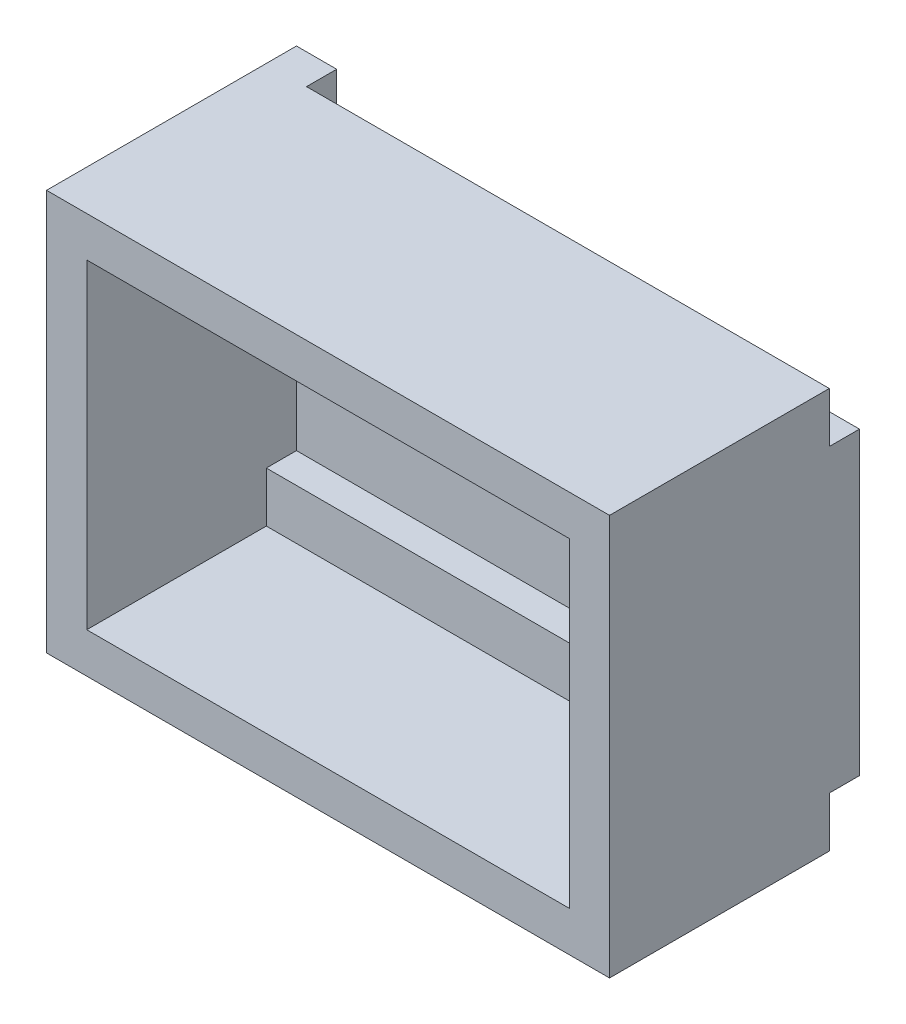
ISO-10303-21;
HEADER;
FILE_DESCRIPTION(('STEP AP214'),'2;1');
FILE_NAME('part.step','',(''),(''),'','','');
FILE_SCHEMA(('AUTOMOTIVE_DESIGN { 1 0 10303 214 1 1 1 1 }'));
ENDSEC;
DATA;
#1=APPLICATION_CONTEXT('core data for automotive mechanical design processes');
#2=APPLICATION_PROTOCOL_DEFINITION('international standard','automotive_design',2000,#1);
#3=PRODUCT_CONTEXT('',#1,'mechanical');
#4=PRODUCT('Part','Part','',(#3));
#5=PRODUCT_RELATED_PRODUCT_CATEGORY('part','',(#4));
#6=PRODUCT_DEFINITION_FORMATION('','',#4);
#7=PRODUCT_DEFINITION_CONTEXT('part definition',#1,'design');
#8=PRODUCT_DEFINITION('design','',#6,#7);
#9=PRODUCT_DEFINITION_SHAPE('','',#8);
#10=(LENGTH_UNIT() NAMED_UNIT(*) SI_UNIT(.MILLI.,.METRE.));
#11=(NAMED_UNIT(*) PLANE_ANGLE_UNIT() SI_UNIT($,.RADIAN.));
#12=(NAMED_UNIT(*) SI_UNIT($,.STERADIAN.) SOLID_ANGLE_UNIT());
#13=UNCERTAINTY_MEASURE_WITH_UNIT(LENGTH_MEASURE(1.E-05),#10,'distance_accuracy_value','');
#14=(GEOMETRIC_REPRESENTATION_CONTEXT(3) GLOBAL_UNCERTAINTY_ASSIGNED_CONTEXT((#13)) GLOBAL_UNIT_ASSIGNED_CONTEXT((#10,
#11,#12)) REPRESENTATION_CONTEXT('',''));
#15=CARTESIAN_POINT('',(0.,0.,0.));
#16=DIRECTION('',(0.,0.,1.));
#17=DIRECTION('',(1.,0.,0.));
#18=AXIS2_PLACEMENT_3D('',#15,#16,#17);
#19=CARTESIAN_POINT('',(0.,0.,12.4298));
#20=DIRECTION('',(0.,0.,-1.));
#21=DIRECTION('',(-1.,0.,0.));
#22=AXIS2_PLACEMENT_3D('',#19,#20,#21);
#23=PLANE('',#22);
#24=DIRECTION('',(-1.,0.,0.));
#25=VECTOR('',#24,1.);
#26=CARTESIAN_POINT('',(14.,9.96365,12.4298));
#27=LINE('',#26,#25);
#28=CARTESIAN_POINT('',(14.,9.96365,12.4298));
#29=VERTEX_POINT('',#28);
#30=CARTESIAN_POINT('',(-14.,9.96365,12.4298));
#31=VERTEX_POINT('',#30);
#32=EDGE_CURVE('E282',#29,#31,#27,.T.);
#33=ORIENTED_EDGE('',*,*,#32,.T.);
#34=DIRECTION('',(0.,-1.,0.));
#35=VECTOR('',#34,1.);
#36=CARTESIAN_POINT('',(-14.,-9.96365,12.4298));
#37=LINE('',#36,#35);
#38=CARTESIAN_POINT('',(-14.,-9.96365,12.4298));
#39=VERTEX_POINT('',#38);
#40=EDGE_CURVE('E285',#31,#39,#37,.T.);
#41=ORIENTED_EDGE('',*,*,#40,.T.);
#42=DIRECTION('',(1.,0.,0.));
#43=VECTOR('',#42,1.);
#44=CARTESIAN_POINT('',(14.,-9.96365,12.4298));
#45=LINE('',#44,#43);
#46=CARTESIAN_POINT('',(14.,-9.96365,12.4298));
#47=VERTEX_POINT('',#46);
#48=EDGE_CURVE('E288',#39,#47,#45,.T.);
#49=ORIENTED_EDGE('',*,*,#48,.T.);
#50=DIRECTION('',(0.,1.,0.));
#51=VECTOR('',#50,1.);
#52=CARTESIAN_POINT('',(14.,-9.96365,12.4298));
#53=LINE('',#52,#51);
#54=EDGE_CURVE('E290',#47,#29,#53,.T.);
#55=ORIENTED_EDGE('',*,*,#54,.T.);
#56=EDGE_LOOP('',(#33,#41,#49,#55));
#57=FACE_BOUND('',#56,.T.);
#58=DIRECTION('',(-1.,0.,0.));
#59=VECTOR('',#58,1.);
#60=CARTESIAN_POINT('',(0.,7.96365,12.4298));
#61=LINE('',#60,#59);
#62=CARTESIAN_POINT('',(12.,7.96365,12.4298));
#63=VERTEX_POINT('',#62);
#64=CARTESIAN_POINT('',(-12.,7.96365,12.4298));
#65=VERTEX_POINT('',#64);
#66=EDGE_CURVE('E220',#63,#65,#61,.T.);
#67=ORIENTED_EDGE('',*,*,#66,.F.);
#68=DIRECTION('',(0.,1.,0.));
#69=VECTOR('',#68,1.);
#70=CARTESIAN_POINT('',(12.,0.,12.4298));
#71=LINE('',#70,#69);
#72=CARTESIAN_POINT('',(12.,-7.96365,12.4298));
#73=VERTEX_POINT('',#72);
#74=EDGE_CURVE('E195',#73,#63,#71,.T.);
#75=ORIENTED_EDGE('',*,*,#74,.F.);
#76=DIRECTION('',(1.,0.,0.));
#77=VECTOR('',#76,1.);
#78=CARTESIAN_POINT('',(0.,-7.96365,12.4298));
#79=LINE('',#78,#77);
#80=CARTESIAN_POINT('',(-12.,-7.96365,12.4298));
#81=VERTEX_POINT('',#80);
#82=EDGE_CURVE('E199',#81,#73,#79,.T.);
#83=ORIENTED_EDGE('',*,*,#82,.F.);
#84=DIRECTION('',(0.,-1.,0.));
#85=VECTOR('',#84,1.);
#86=CARTESIAN_POINT('',(-12.,0.,12.4298));
#87=LINE('',#86,#85);
#88=EDGE_CURVE('E228',#65,#81,#87,.T.);
#89=ORIENTED_EDGE('',*,*,#88,.F.);
#90=EDGE_LOOP('',(#67,#75,#83,#89));
#91=FACE_BOUND('',#90,.T.);
#92=ADVANCED_FACE('F45',(#57,#91),#23,.F.);
#93=CARTESIAN_POINT('',(14.,9.96365,12.4298));
#94=DIRECTION('',(0.,-1.,0.));
#95=DIRECTION('',(0.,0.,-1.));
#96=AXIS2_PLACEMENT_3D('',#93,#94,#95);
#97=PLANE('',#96);
#98=DIRECTION('',(0.,0.,-1.));
#99=VECTOR('',#98,1.);
#100=CARTESIAN_POINT('',(14.,9.96365,12.4298));
#101=LINE('',#100,#99);
#102=CARTESIAN_POINT('',(14.,9.96365,1.5));
#103=VERTEX_POINT('',#102);
#104=EDGE_CURVE('E292',#29,#103,#101,.T.);
#105=ORIENTED_EDGE('',*,*,#104,.T.);
#106=DIRECTION('',(1.,0.,0.));
#107=VECTOR('',#106,1.);
#108=CARTESIAN_POINT('',(-16.9154759474226,9.96365,1.5));
#109=LINE('',#108,#107);
#110=CARTESIAN_POINT('',(-12.,9.96365,1.5));
#111=VERTEX_POINT('',#110);
#112=EDGE_CURVE('E266',#111,#103,#109,.T.);
#113=ORIENTED_EDGE('',*,*,#112,.F.);
#114=DIRECTION('',(0.,0.,-1.));
#115=VECTOR('',#114,1.);
#116=CARTESIAN_POINT('',(-12.,9.96365,0.));
#117=LINE('',#116,#115);
#118=CARTESIAN_POINT('',(-12.,9.96365,0.));
#119=VERTEX_POINT('',#118);
#120=EDGE_CURVE('E265',#111,#119,#117,.T.);
#121=ORIENTED_EDGE('',*,*,#120,.T.);
#122=DIRECTION('',(-1.,0.,0.));
#123=VECTOR('',#122,1.);
#124=CARTESIAN_POINT('',(14.,9.96365,0.));
#125=LINE('',#124,#123);
#126=CARTESIAN_POINT('',(-14.,9.96365,0.));
#127=VERTEX_POINT('',#126);
#128=EDGE_CURVE('E263',#119,#127,#125,.T.);
#129=ORIENTED_EDGE('',*,*,#128,.T.);
#130=DIRECTION('',(0.,0.,-1.));
#131=VECTOR('',#130,1.);
#132=CARTESIAN_POINT('',(-14.,9.96365,12.4298));
#133=LINE('',#132,#131);
#134=EDGE_CURVE('E12',#31,#127,#133,.T.);
#135=ORIENTED_EDGE('',*,*,#134,.F.);
#136=ORIENTED_EDGE('',*,*,#32,.F.);
#137=EDGE_LOOP('',(#105,#113,#121,#129,#135,#136));
#138=FACE_BOUND('',#137,.T.);
#139=ADVANCED_FACE('F47',(#138),#97,.F.);
#140=CARTESIAN_POINT('',(-14.,-9.96365,12.4298));
#141=DIRECTION('',(1.,0.,0.));
#142=DIRECTION('',(0.,0.,-1.));
#143=AXIS2_PLACEMENT_3D('',#140,#141,#142);
#144=PLANE('',#143);
#145=DIRECTION('',(0.,-1.,0.));
#146=VECTOR('',#145,1.);
#147=CARTESIAN_POINT('',(-14.,-9.96365,0.));
#148=LINE('',#147,#146);
#149=CARTESIAN_POINT('',(-14.,-9.96365,0.));
#150=VERTEX_POINT('',#149);
#151=EDGE_CURVE('E294',#127,#150,#148,.T.);
#152=ORIENTED_EDGE('',*,*,#151,.T.);
#153=DIRECTION('',(0.,0.,-1.));
#154=VECTOR('',#153,1.);
#155=CARTESIAN_POINT('',(-14.,-9.96365,12.4298));
#156=LINE('',#155,#154);
#157=EDGE_CURVE('E53',#39,#150,#156,.T.);
#158=ORIENTED_EDGE('',*,*,#157,.F.);
#159=ORIENTED_EDGE('',*,*,#40,.F.);
#160=ORIENTED_EDGE('',*,*,#134,.T.);
#161=EDGE_LOOP('',(#152,#158,#159,#160));
#162=FACE_BOUND('',#161,.T.);
#163=ADVANCED_FACE('F337',(#162),#144,.F.);
#164=CARTESIAN_POINT('',(14.,-9.96365,12.4298));
#165=DIRECTION('',(0.,1.,0.));
#166=DIRECTION('',(0.,0.,1.));
#167=AXIS2_PLACEMENT_3D('',#164,#165,#166);
#168=PLANE('',#167);
#169=DIRECTION('',(0.,0.,1.));
#170=VECTOR('',#169,1.);
#171=CARTESIAN_POINT('',(-12.,-9.96365,0.));
#172=LINE('',#171,#170);
#173=CARTESIAN_POINT('',(-12.,-9.96365,0.));
#174=VERTEX_POINT('',#173);
#175=CARTESIAN_POINT('',(-12.,-9.96365,1.5));
#176=VERTEX_POINT('',#175);
#177=EDGE_CURVE('E245',#174,#176,#172,.T.);
#178=ORIENTED_EDGE('',*,*,#177,.T.);
#179=DIRECTION('',(1.,0.,0.));
#180=VECTOR('',#179,1.);
#181=CARTESIAN_POINT('',(-16.9154759474226,-9.96365,1.5));
#182=LINE('',#181,#180);
#183=CARTESIAN_POINT('',(14.,-9.96365,1.5));
#184=VERTEX_POINT('',#183);
#185=EDGE_CURVE('E243',#176,#184,#182,.T.);
#186=ORIENTED_EDGE('',*,*,#185,.T.);
#187=DIRECTION('',(0.,0.,-1.));
#188=VECTOR('',#187,1.);
#189=CARTESIAN_POINT('',(14.,-9.96365,12.4298));
#190=LINE('',#189,#188);
#191=EDGE_CURVE('E303',#47,#184,#190,.T.);
#192=ORIENTED_EDGE('',*,*,#191,.F.);
#193=ORIENTED_EDGE('',*,*,#48,.F.);
#194=ORIENTED_EDGE('',*,*,#157,.T.);
#195=DIRECTION('',(1.,0.,0.));
#196=VECTOR('',#195,1.);
#197=CARTESIAN_POINT('',(14.,-9.96365,0.));
#198=LINE('',#197,#196);
#199=EDGE_CURVE('E296',#150,#174,#198,.T.);
#200=ORIENTED_EDGE('',*,*,#199,.T.);
#201=EDGE_LOOP('',(#178,#186,#192,#193,#194,#200));
#202=FACE_BOUND('',#201,.T.);
#203=ADVANCED_FACE('F310',(#202),#168,.F.);
#204=CARTESIAN_POINT('',(14.,-9.96365,12.4298));
#205=DIRECTION('',(-1.,0.,0.));
#206=DIRECTION('',(0.,0.,1.));
#207=AXIS2_PLACEMENT_3D('',#204,#205,#206);
#208=PLANE('',#207);
#209=ORIENTED_EDGE('',*,*,#191,.T.);
#210=DIRECTION('',(0.,-1.,0.));
#211=VECTOR('',#210,1.);
#212=CARTESIAN_POINT('',(14.,-9.96365,1.5));
#213=LINE('',#212,#211);
#214=CARTESIAN_POINT('',(14.,-7.46365,1.5));
#215=VERTEX_POINT('',#214);
#216=EDGE_CURVE('E252',#215,#184,#213,.T.);
#217=ORIENTED_EDGE('',*,*,#216,.F.);
#218=DIRECTION('',(0.,0.,1.));
#219=VECTOR('',#218,1.);
#220=CARTESIAN_POINT('',(14.,-7.46365,0.));
#221=LINE('',#220,#219);
#222=CARTESIAN_POINT('',(14.,-7.46365,0.));
#223=VERTEX_POINT('',#222);
#224=EDGE_CURVE('E249',#223,#215,#221,.T.);
#225=ORIENTED_EDGE('',*,*,#224,.F.);
#226=DIRECTION('',(0.,1.,0.));
#227=VECTOR('',#226,1.);
#228=CARTESIAN_POINT('',(14.,-9.96365,0.));
#229=LINE('',#228,#227);
#230=CARTESIAN_POINT('',(14.,7.46365,0.));
#231=VERTEX_POINT('',#230);
#232=EDGE_CURVE('E286',#223,#231,#229,.T.);
#233=ORIENTED_EDGE('',*,*,#232,.T.);
#234=DIRECTION('',(0.,0.,-1.));
#235=VECTOR('',#234,1.);
#236=CARTESIAN_POINT('',(14.,7.46365,0.));
#237=LINE('',#236,#235);
#238=CARTESIAN_POINT('',(14.,7.46365,1.5));
#239=VERTEX_POINT('',#238);
#240=EDGE_CURVE('E268',#239,#231,#237,.T.);
#241=ORIENTED_EDGE('',*,*,#240,.F.);
#242=DIRECTION('',(0.,-1.,0.));
#243=VECTOR('',#242,1.);
#244=CARTESIAN_POINT('',(14.,9.96365,1.5));
#245=LINE('',#244,#243);
#246=EDGE_CURVE('E253',#103,#239,#245,.T.);
#247=ORIENTED_EDGE('',*,*,#246,.F.);
#248=ORIENTED_EDGE('',*,*,#104,.F.);
#249=ORIENTED_EDGE('',*,*,#54,.F.);
#250=EDGE_LOOP('',(#209,#217,#225,#233,#241,#247,#248,#249));
#251=FACE_BOUND('',#250,.T.);
#252=ADVANCED_FACE('F329',(#251),#208,.F.);
#253=CARTESIAN_POINT('',(0.,0.,0.));
#254=DIRECTION('',(0.,0.,-1.));
#255=DIRECTION('',(-1.,0.,0.));
#256=AXIS2_PLACEMENT_3D('',#253,#254,#255);
#257=PLANE('',#256);
#258=DIRECTION('',(1.,0.,0.));
#259=VECTOR('',#258,1.);
#260=CARTESIAN_POINT('',(-16.9154759474226,-7.46365,0.));
#261=LINE('',#260,#259);
#262=CARTESIAN_POINT('',(-12.,-7.46365,0.));
#263=VERTEX_POINT('',#262);
#264=EDGE_CURVE('E255',#263,#223,#261,.T.);
#265=ORIENTED_EDGE('',*,*,#264,.F.);
#266=DIRECTION('',(0.,-1.,0.));
#267=VECTOR('',#266,1.);
#268=CARTESIAN_POINT('',(-12.,-9.96365,0.));
#269=LINE('',#268,#267);
#270=EDGE_CURVE('E248',#263,#174,#269,.T.);
#271=ORIENTED_EDGE('',*,*,#270,.T.);
#272=ORIENTED_EDGE('',*,*,#199,.F.);
#273=ORIENTED_EDGE('',*,*,#151,.F.);
#274=ORIENTED_EDGE('',*,*,#128,.F.);
#275=DIRECTION('',(0.,-1.,0.));
#276=VECTOR('',#275,1.);
#277=CARTESIAN_POINT('',(-12.,9.96365,0.));
#278=LINE('',#277,#276);
#279=CARTESIAN_POINT('',(-12.,7.46365,0.));
#280=VERTEX_POINT('',#279);
#281=EDGE_CURVE('E278',#119,#280,#278,.T.);
#282=ORIENTED_EDGE('',*,*,#281,.T.);
#283=DIRECTION('',(1.,0.,0.));
#284=VECTOR('',#283,1.);
#285=CARTESIAN_POINT('',(-16.9154759474226,7.46365,0.));
#286=LINE('',#285,#284);
#287=EDGE_CURVE('E68',#280,#231,#286,.T.);
#288=ORIENTED_EDGE('',*,*,#287,.T.);
#289=ORIENTED_EDGE('',*,*,#232,.F.);
#290=EDGE_LOOP('',(#265,#271,#272,#273,#274,#282,#288,#289));
#291=FACE_BOUND('',#290,.T.);
#292=ADVANCED_FACE('F316',(#291),#257,.T.);
#293=CARTESIAN_POINT('',(-16.9154759474226,7.46365,0.));
#294=DIRECTION('',(0.,-1.,0.));
#295=DIRECTION('',(0.,0.,-1.));
#296=AXIS2_PLACEMENT_3D('',#293,#294,#295);
#297=PLANE('',#296);
#298=DIRECTION('',(0.,0.,1.));
#299=VECTOR('',#298,1.);
#300=CARTESIAN_POINT('',(-12.,7.46365,0.));
#301=LINE('',#300,#299);
#302=CARTESIAN_POINT('',(-12.,7.46365,1.5));
#303=VERTEX_POINT('',#302);
#304=EDGE_CURVE('E272',#280,#303,#301,.T.);
#305=ORIENTED_EDGE('',*,*,#304,.T.);
#306=DIRECTION('',(1.,0.,0.));
#307=VECTOR('',#306,1.);
#308=CARTESIAN_POINT('',(-16.9154759474226,7.46365,1.5));
#309=LINE('',#308,#307);
#310=EDGE_CURVE('E269',#303,#239,#309,.T.);
#311=ORIENTED_EDGE('',*,*,#310,.T.);
#312=ORIENTED_EDGE('',*,*,#240,.T.);
#313=ORIENTED_EDGE('',*,*,#287,.F.);
#314=EDGE_LOOP('',(#305,#311,#312,#313));
#315=FACE_BOUND('',#314,.T.);
#316=ADVANCED_FACE('F345',(#315),#297,.F.);
#317=CARTESIAN_POINT('',(-16.9154759474226,9.96365,1.5));
#318=DIRECTION('',(0.,0.,1.));
#319=DIRECTION('',(0.,-1.,0.));
#320=AXIS2_PLACEMENT_3D('',#317,#318,#319);
#321=PLANE('',#320);
#322=DIRECTION('',(0.,1.,0.));
#323=VECTOR('',#322,1.);
#324=CARTESIAN_POINT('',(-12.,9.96365,1.5));
#325=LINE('',#324,#323);
#326=EDGE_CURVE('E239',#303,#111,#325,.T.);
#327=ORIENTED_EDGE('',*,*,#326,.T.);
#328=ORIENTED_EDGE('',*,*,#112,.T.);
#329=ORIENTED_EDGE('',*,*,#246,.T.);
#330=ORIENTED_EDGE('',*,*,#310,.F.);
#331=EDGE_LOOP('',(#327,#328,#329,#330));
#332=FACE_BOUND('',#331,.T.);
#333=ADVANCED_FACE('F347',(#332),#321,.F.);
#334=CARTESIAN_POINT('',(-12.,-9.96365,12.4298));
#335=DIRECTION('',(1.,0.,0.));
#336=DIRECTION('',(0.,0.,-1.));
#337=AXIS2_PLACEMENT_3D('',#334,#335,#336);
#338=PLANE('',#337);
#339=ORIENTED_EDGE('',*,*,#120,.F.);
#340=ORIENTED_EDGE('',*,*,#326,.F.);
#341=ORIENTED_EDGE('',*,*,#304,.F.);
#342=ORIENTED_EDGE('',*,*,#281,.F.);
#343=EDGE_LOOP('',(#339,#340,#341,#342));
#344=FACE_BOUND('',#343,.T.);
#345=ADVANCED_FACE('F342',(#344),#338,.T.);
#346=CARTESIAN_POINT('',(-16.9154759474226,-9.96365,1.5));
#347=DIRECTION('',(0.,0.,1.));
#348=DIRECTION('',(1.,0.,0.));
#349=AXIS2_PLACEMENT_3D('',#346,#347,#348);
#350=PLANE('',#349);
#351=DIRECTION('',(0.,1.,0.));
#352=VECTOR('',#351,1.);
#353=CARTESIAN_POINT('',(-12.,-9.96365,1.5));
#354=LINE('',#353,#352);
#355=CARTESIAN_POINT('',(-12.,-7.46365,1.5));
#356=VERTEX_POINT('',#355);
#357=EDGE_CURVE('E242',#176,#356,#354,.T.);
#358=ORIENTED_EDGE('',*,*,#357,.T.);
#359=DIRECTION('',(1.,0.,0.));
#360=VECTOR('',#359,1.);
#361=CARTESIAN_POINT('',(-16.9154759474226,-7.46365,1.5));
#362=LINE('',#361,#360);
#363=EDGE_CURVE('E258',#356,#215,#362,.T.);
#364=ORIENTED_EDGE('',*,*,#363,.T.);
#365=ORIENTED_EDGE('',*,*,#216,.T.);
#366=ORIENTED_EDGE('',*,*,#185,.F.);
#367=EDGE_LOOP('',(#358,#364,#365,#366));
#368=FACE_BOUND('',#367,.T.);
#369=ADVANCED_FACE('F351',(#368),#350,.F.);
#370=CARTESIAN_POINT('',(-16.9154759474226,-7.46365,0.));
#371=DIRECTION('',(0.,1.,0.));
#372=DIRECTION('',(0.,0.,1.));
#373=AXIS2_PLACEMENT_3D('',#370,#371,#372);
#374=PLANE('',#373);
#375=DIRECTION('',(0.,0.,-1.));
#376=VECTOR('',#375,1.);
#377=CARTESIAN_POINT('',(-12.,-7.46365,0.));
#378=LINE('',#377,#376);
#379=EDGE_CURVE('E240',#356,#263,#378,.T.);
#380=ORIENTED_EDGE('',*,*,#379,.T.);
#381=ORIENTED_EDGE('',*,*,#264,.T.);
#382=ORIENTED_EDGE('',*,*,#224,.T.);
#383=ORIENTED_EDGE('',*,*,#363,.F.);
#384=EDGE_LOOP('',(#380,#381,#382,#383));
#385=FACE_BOUND('',#384,.T.);
#386=ADVANCED_FACE('F350',(#385),#374,.F.);
#387=CARTESIAN_POINT('',(-12.,-9.96365,12.4298));
#388=DIRECTION('',(1.,0.,0.));
#389=DIRECTION('',(0.,0.,-1.));
#390=AXIS2_PLACEMENT_3D('',#387,#388,#389);
#391=PLANE('',#390);
#392=ORIENTED_EDGE('',*,*,#177,.F.);
#393=ORIENTED_EDGE('',*,*,#270,.F.);
#394=ORIENTED_EDGE('',*,*,#379,.F.);
#395=ORIENTED_EDGE('',*,*,#357,.F.);
#396=EDGE_LOOP('',(#392,#393,#394,#395));
#397=FACE_BOUND('',#396,.T.);
#398=ADVANCED_FACE('F322',(#397),#391,.T.);
#399=CARTESIAN_POINT('',(14.,7.96365,12.4298));
#400=DIRECTION('',(0.,-1.,0.));
#401=DIRECTION('',(0.,0.,-1.));
#402=AXIS2_PLACEMENT_3D('',#399,#400,#401);
#403=PLANE('',#402);
#404=DIRECTION('',(0.,0.,-1.));
#405=VECTOR('',#404,1.);
#406=CARTESIAN_POINT('',(12.,7.96365,12.4298));
#407=LINE('',#406,#405);
#408=CARTESIAN_POINT('',(12.,7.96365,3.5));
#409=VERTEX_POINT('',#408);
#410=EDGE_CURVE('E177',#63,#409,#407,.T.);
#411=ORIENTED_EDGE('',*,*,#410,.F.);
#412=ORIENTED_EDGE('',*,*,#66,.T.);
#413=DIRECTION('',(0.,0.,-1.));
#414=VECTOR('',#413,1.);
#415=CARTESIAN_POINT('',(-12.,7.96365,12.4298));
#416=LINE('',#415,#414);
#417=CARTESIAN_POINT('',(-12.,7.96365,3.5));
#418=VERTEX_POINT('',#417);
#419=EDGE_CURVE('E179',#65,#418,#416,.T.);
#420=ORIENTED_EDGE('',*,*,#419,.T.);
#421=DIRECTION('',(1.,0.,0.));
#422=VECTOR('',#421,1.);
#423=CARTESIAN_POINT('',(-16.9154759474226,7.96365,3.5));
#424=LINE('',#423,#422);
#425=EDGE_CURVE('E172',#418,#409,#424,.T.);
#426=ORIENTED_EDGE('',*,*,#425,.T.);
#427=EDGE_LOOP('',(#411,#412,#420,#426));
#428=FACE_BOUND('',#427,.T.);
#429=ADVANCED_FACE('F174',(#428),#403,.T.);
#430=CARTESIAN_POINT('',(-12.,-9.96365,12.4298));
#431=DIRECTION('',(1.,0.,0.));
#432=DIRECTION('',(0.,0.,-1.));
#433=AXIS2_PLACEMENT_3D('',#430,#431,#432);
#434=PLANE('',#433);
#435=ORIENTED_EDGE('',*,*,#419,.F.);
#436=ORIENTED_EDGE('',*,*,#88,.T.);
#437=DIRECTION('',(0.,0.,-1.));
#438=VECTOR('',#437,1.);
#439=CARTESIAN_POINT('',(-12.,-7.96365,12.4298));
#440=LINE('',#439,#438);
#441=CARTESIAN_POINT('',(-12.,-7.96365,3.5));
#442=VERTEX_POINT('',#441);
#443=EDGE_CURVE('E197',#81,#442,#440,.T.);
#444=ORIENTED_EDGE('',*,*,#443,.T.);
#445=DIRECTION('',(0.,1.,0.));
#446=VECTOR('',#445,1.);
#447=CARTESIAN_POINT('',(-12.,-9.96365,3.5));
#448=LINE('',#447,#446);
#449=CARTESIAN_POINT('',(-12.,-5.46365,3.5));
#450=VERTEX_POINT('',#449);
#451=EDGE_CURVE('E234',#442,#450,#448,.T.);
#452=ORIENTED_EDGE('',*,*,#451,.T.);
#453=DIRECTION('',(0.,0.,1.));
#454=VECTOR('',#453,1.);
#455=CARTESIAN_POINT('',(-12.,-5.46365,12.4298));
#456=LINE('',#455,#454);
#457=CARTESIAN_POINT('',(-12.,-5.46365,2.));
#458=VERTEX_POINT('',#457);
#459=EDGE_CURVE('E203',#458,#450,#456,.T.);
#460=ORIENTED_EDGE('',*,*,#459,.F.);
#461=DIRECTION('',(0.,-1.,0.));
#462=VECTOR('',#461,1.);
#463=CARTESIAN_POINT('',(-12.,0.,2.));
#464=LINE('',#463,#462);
#465=CARTESIAN_POINT('',(-12.,5.46365,2.));
#466=VERTEX_POINT('',#465);
#467=EDGE_CURVE('E204',#466,#458,#464,.T.);
#468=ORIENTED_EDGE('',*,*,#467,.F.);
#469=DIRECTION('',(0.,0.,1.));
#470=VECTOR('',#469,1.);
#471=CARTESIAN_POINT('',(-12.,5.46365,0.));
#472=LINE('',#471,#470);
#473=CARTESIAN_POINT('',(-12.,5.46365,3.5));
#474=VERTEX_POINT('',#473);
#475=EDGE_CURVE('E232',#466,#474,#472,.T.);
#476=ORIENTED_EDGE('',*,*,#475,.T.);
#477=DIRECTION('',(0.,-1.,0.));
#478=VECTOR('',#477,1.);
#479=CARTESIAN_POINT('',(-12.,-9.96365,3.5));
#480=LINE('',#479,#478);
#481=EDGE_CURVE('E237',#418,#474,#480,.T.);
#482=ORIENTED_EDGE('',*,*,#481,.F.);
#483=EDGE_LOOP('',(#435,#436,#444,#452,#460,#468,#476,#482));
#484=FACE_BOUND('',#483,.T.);
#485=ADVANCED_FACE('F445',(#484),#434,.T.);
#486=CARTESIAN_POINT('',(14.,-7.96365,12.4298));
#487=DIRECTION('',(0.,1.,0.));
#488=DIRECTION('',(0.,0.,1.));
#489=AXIS2_PLACEMENT_3D('',#486,#487,#488);
#490=PLANE('',#489);
#491=ORIENTED_EDGE('',*,*,#443,.F.);
#492=ORIENTED_EDGE('',*,*,#82,.T.);
#493=DIRECTION('',(0.,0.,-1.));
#494=VECTOR('',#493,1.);
#495=CARTESIAN_POINT('',(12.,-7.96365,12.4298));
#496=LINE('',#495,#494);
#497=CARTESIAN_POINT('',(12.,-7.96365,3.5));
#498=VERTEX_POINT('',#497);
#499=EDGE_CURVE('E60',#73,#498,#496,.T.);
#500=ORIENTED_EDGE('',*,*,#499,.T.);
#501=DIRECTION('',(1.,0.,0.));
#502=VECTOR('',#501,1.);
#503=CARTESIAN_POINT('',(14.,-7.96365,3.5));
#504=LINE('',#503,#502);
#505=EDGE_CURVE('E208',#442,#498,#504,.T.);
#506=ORIENTED_EDGE('',*,*,#505,.F.);
#507=EDGE_LOOP('',(#491,#492,#500,#506));
#508=FACE_BOUND('',#507,.T.);
#509=ADVANCED_FACE('F454',(#508),#490,.T.);
#510=CARTESIAN_POINT('',(12.,-9.96365,12.4298));
#511=DIRECTION('',(-1.,0.,0.));
#512=DIRECTION('',(0.,0.,1.));
#513=AXIS2_PLACEMENT_3D('',#510,#511,#512);
#514=PLANE('',#513);
#515=ORIENTED_EDGE('',*,*,#499,.F.);
#516=ORIENTED_EDGE('',*,*,#74,.T.);
#517=ORIENTED_EDGE('',*,*,#410,.T.);
#518=DIRECTION('',(0.,-1.,0.));
#519=VECTOR('',#518,1.);
#520=CARTESIAN_POINT('',(12.,9.96365,3.5));
#521=LINE('',#520,#519);
#522=CARTESIAN_POINT('',(12.,5.46365,3.5));
#523=VERTEX_POINT('',#522);
#524=EDGE_CURVE('E186',#409,#523,#521,.T.);
#525=ORIENTED_EDGE('',*,*,#524,.T.);
#526=DIRECTION('',(0.,0.,-1.));
#527=VECTOR('',#526,1.);
#528=CARTESIAN_POINT('',(12.,5.46365,0.));
#529=LINE('',#528,#527);
#530=CARTESIAN_POINT('',(12.,5.46365,2.));
#531=VERTEX_POINT('',#530);
#532=EDGE_CURVE('E182',#523,#531,#529,.T.);
#533=ORIENTED_EDGE('',*,*,#532,.T.);
#534=DIRECTION('',(0.,1.,0.));
#535=VECTOR('',#534,1.);
#536=CARTESIAN_POINT('',(12.,0.,2.));
#537=LINE('',#536,#535);
#538=CARTESIAN_POINT('',(12.,-5.46365,2.));
#539=VERTEX_POINT('',#538);
#540=EDGE_CURVE('E207',#539,#531,#537,.T.);
#541=ORIENTED_EDGE('',*,*,#540,.F.);
#542=DIRECTION('',(0.,0.,1.));
#543=VECTOR('',#542,1.);
#544=CARTESIAN_POINT('',(12.,-5.46365,0.));
#545=LINE('',#544,#543);
#546=CARTESIAN_POINT('',(12.,-5.46365,3.5));
#547=VERTEX_POINT('',#546);
#548=EDGE_CURVE('E191',#539,#547,#545,.T.);
#549=ORIENTED_EDGE('',*,*,#548,.T.);
#550=DIRECTION('',(0.,-1.,0.));
#551=VECTOR('',#550,1.);
#552=CARTESIAN_POINT('',(12.,-9.96365,3.5));
#553=LINE('',#552,#551);
#554=EDGE_CURVE('E213',#547,#498,#553,.T.);
#555=ORIENTED_EDGE('',*,*,#554,.T.);
#556=EDGE_LOOP('',(#515,#516,#517,#525,#533,#541,#549,#555));
#557=FACE_BOUND('',#556,.T.);
#558=ADVANCED_FACE('F193',(#557),#514,.T.);
#559=CARTESIAN_POINT('',(0.,0.,2.));
#560=DIRECTION('',(0.,0.,-1.));
#561=DIRECTION('',(-1.,0.,0.));
#562=AXIS2_PLACEMENT_3D('',#559,#560,#561);
#563=PLANE('',#562);
#564=DIRECTION('',(1.,0.,0.));
#565=VECTOR('',#564,1.);
#566=CARTESIAN_POINT('',(0.,-5.46365,2.));
#567=LINE('',#566,#565);
#568=EDGE_CURVE('E215',#458,#539,#567,.T.);
#569=ORIENTED_EDGE('',*,*,#568,.T.);
#570=ORIENTED_EDGE('',*,*,#540,.T.);
#571=DIRECTION('',(1.,0.,0.));
#572=VECTOR('',#571,1.);
#573=CARTESIAN_POINT('',(-16.9154759474226,5.46365,2.));
#574=LINE('',#573,#572);
#575=EDGE_CURVE('E223',#466,#531,#574,.T.);
#576=ORIENTED_EDGE('',*,*,#575,.F.);
#577=ORIENTED_EDGE('',*,*,#467,.T.);
#578=EDGE_LOOP('',(#569,#570,#576,#577));
#579=FACE_BOUND('',#578,.T.);
#580=ADVANCED_FACE('F473',(#579),#563,.F.);
#581=CARTESIAN_POINT('',(-16.9154759474226,5.46365,0.));
#582=DIRECTION('',(0.,-1.,0.));
#583=DIRECTION('',(0.,0.,-1.));
#584=AXIS2_PLACEMENT_3D('',#581,#582,#583);
#585=PLANE('',#584);
#586=ORIENTED_EDGE('',*,*,#575,.T.);
#587=ORIENTED_EDGE('',*,*,#532,.F.);
#588=DIRECTION('',(1.,0.,0.));
#589=VECTOR('',#588,1.);
#590=CARTESIAN_POINT('',(-16.9154759474226,5.46365,3.5));
#591=LINE('',#590,#589);
#592=EDGE_CURVE('E183',#474,#523,#591,.T.);
#593=ORIENTED_EDGE('',*,*,#592,.F.);
#594=ORIENTED_EDGE('',*,*,#475,.F.);
#595=EDGE_LOOP('',(#586,#587,#593,#594));
#596=FACE_BOUND('',#595,.T.);
#597=ADVANCED_FACE('F482',(#596),#585,.T.);
#598=CARTESIAN_POINT('',(-16.9154759474226,9.96365,3.5));
#599=DIRECTION('',(0.,0.,1.));
#600=DIRECTION('',(0.,-1.,0.));
#601=AXIS2_PLACEMENT_3D('',#598,#599,#600);
#602=PLANE('',#601);
#603=ORIENTED_EDGE('',*,*,#481,.T.);
#604=ORIENTED_EDGE('',*,*,#592,.T.);
#605=ORIENTED_EDGE('',*,*,#524,.F.);
#606=ORIENTED_EDGE('',*,*,#425,.F.);
#607=EDGE_LOOP('',(#603,#604,#605,#606));
#608=FACE_BOUND('',#607,.T.);
#609=ADVANCED_FACE('F187',(#608),#602,.T.);
#610=CARTESIAN_POINT('',(-16.9154759474226,-9.96365,3.5));
#611=DIRECTION('',(0.,0.,1.));
#612=DIRECTION('',(1.,0.,0.));
#613=AXIS2_PLACEMENT_3D('',#610,#611,#612);
#614=PLANE('',#613);
#615=ORIENTED_EDGE('',*,*,#505,.T.);
#616=ORIENTED_EDGE('',*,*,#554,.F.);
#617=DIRECTION('',(1.,0.,0.));
#618=VECTOR('',#617,1.);
#619=CARTESIAN_POINT('',(-16.9154759474226,-5.46365,3.5));
#620=LINE('',#619,#618);
#621=EDGE_CURVE('E211',#450,#547,#620,.T.);
#622=ORIENTED_EDGE('',*,*,#621,.F.);
#623=ORIENTED_EDGE('',*,*,#451,.F.);
#624=EDGE_LOOP('',(#615,#616,#622,#623));
#625=FACE_BOUND('',#624,.T.);
#626=ADVANCED_FACE('F501',(#625),#614,.T.);
#627=CARTESIAN_POINT('',(-16.9154759474226,-5.46365,0.));
#628=DIRECTION('',(0.,1.,0.));
#629=DIRECTION('',(0.,0.,1.));
#630=AXIS2_PLACEMENT_3D('',#627,#628,#629);
#631=PLANE('',#630);
#632=ORIENTED_EDGE('',*,*,#459,.T.);
#633=ORIENTED_EDGE('',*,*,#621,.T.);
#634=ORIENTED_EDGE('',*,*,#548,.F.);
#635=ORIENTED_EDGE('',*,*,#568,.F.);
#636=EDGE_LOOP('',(#632,#633,#634,#635));
#637=FACE_BOUND('',#636,.T.);
#638=ADVANCED_FACE('F510',(#637),#631,.T.);
#639=CLOSED_SHELL('',(#92,#139,#163,#203,#252,#292,#316,#333,#345,#369,#386,#398,#429,#485,#509,
#558,#580,#597,#609,#626,#638));
#640=MANIFOLD_SOLID_BREP('B2',#639);
#641=ADVANCED_BREP_SHAPE_REPRESENTATION('',(#18,#640),#14);
#642=SHAPE_DEFINITION_REPRESENTATION(#9,#641);
ENDSEC;
END-ISO-10303-21;
